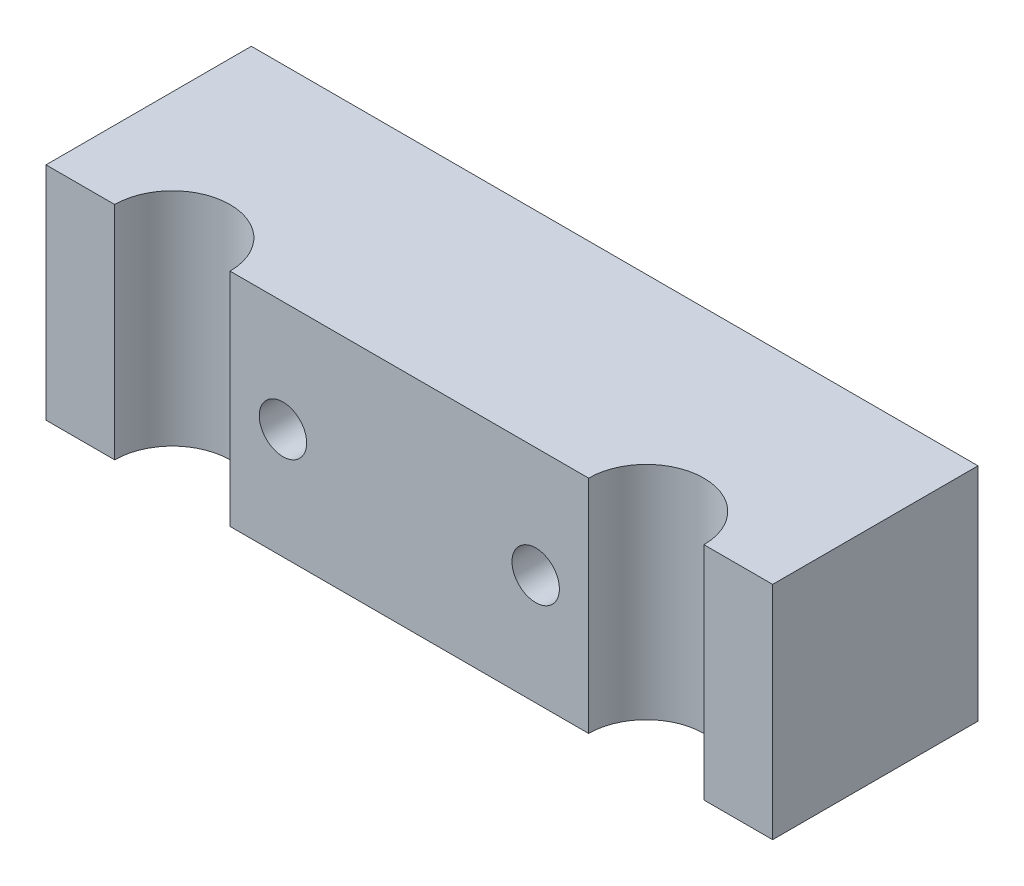
ISO-10303-21;
HEADER;
FILE_DESCRIPTION(('STEP AP214'),'2;1');
FILE_NAME('part.step','',(''),(''),'','','');
FILE_SCHEMA(('AUTOMOTIVE_DESIGN { 1 0 10303 214 1 1 1 1 }'));
ENDSEC;
DATA;
#1=APPLICATION_CONTEXT('core data for automotive mechanical design processes');
#2=APPLICATION_PROTOCOL_DEFINITION('international standard','automotive_design',2000,#1);
#3=PRODUCT_CONTEXT('',#1,'mechanical');
#4=PRODUCT('Part','Part','',(#3));
#5=PRODUCT_RELATED_PRODUCT_CATEGORY('part','',(#4));
#6=PRODUCT_DEFINITION_FORMATION('','',#4);
#7=PRODUCT_DEFINITION_CONTEXT('part definition',#1,'design');
#8=PRODUCT_DEFINITION('design','',#6,#7);
#9=PRODUCT_DEFINITION_SHAPE('','',#8);
#10=(LENGTH_UNIT() NAMED_UNIT(*) SI_UNIT(.MILLI.,.METRE.));
#11=(NAMED_UNIT(*) PLANE_ANGLE_UNIT() SI_UNIT($,.RADIAN.));
#12=(NAMED_UNIT(*) SI_UNIT($,.STERADIAN.) SOLID_ANGLE_UNIT());
#13=UNCERTAINTY_MEASURE_WITH_UNIT(LENGTH_MEASURE(1.E-05),#10,'distance_accuracy_value','');
#14=(GEOMETRIC_REPRESENTATION_CONTEXT(3) GLOBAL_UNCERTAINTY_ASSIGNED_CONTEXT((#13)) GLOBAL_UNIT_ASSIGNED_CONTEXT((#10,
#11,#12)) REPRESENTATION_CONTEXT('',''));
#15=CARTESIAN_POINT('',(0.,0.,0.));
#16=DIRECTION('',(0.,0.,1.));
#17=DIRECTION('',(1.,0.,0.));
#18=AXIS2_PLACEMENT_3D('',#15,#16,#17);
#19=CARTESIAN_POINT('',(8.,0.,-0.000999999999999265));
#20=DIRECTION('',(0.,0.,1.));
#21=DIRECTION('',(1.,0.,0.));
#22=AXIS2_PLACEMENT_3D('',#19,#20,#21);
#23=CYLINDRICAL_SURFACE('',#22,1.5);
#24=CARTESIAN_POINT('',(8.,0.,13.));
#25=DIRECTION('',(0.,0.,1.));
#26=DIRECTION('',(-1.,0.,0.));
#27=AXIS2_PLACEMENT_3D('',#24,#25,#26);
#28=CIRCLE('',#27,1.5);
#29=CARTESIAN_POINT('',(6.5,0.,13.));
#30=VERTEX_POINT('',#29);
#31=EDGE_CURVE('E173',#30,#30,#28,.T.);
#32=ORIENTED_EDGE('',*,*,#31,.T.);
#33=EDGE_LOOP('',(#32));
#34=FACE_BOUND('',#33,.T.);
#35=CARTESIAN_POINT('',(8.,0.,3.8));
#36=DIRECTION('',(0.,0.,-1.));
#37=DIRECTION('',(-1.,0.,0.));
#38=AXIS2_PLACEMENT_3D('',#35,#36,#37);
#39=CIRCLE('',#38,1.5);
#40=CARTESIAN_POINT('',(6.5,0.,3.8));
#41=VERTEX_POINT('',#40);
#42=EDGE_CURVE('E37',#41,#41,#39,.F.);
#43=ORIENTED_EDGE('',*,*,#42,.F.);
#44=EDGE_LOOP('',(#43));
#45=FACE_BOUND('',#44,.T.);
#46=ADVANCED_FACE('F33',(#34,#45),#23,.F.);
#47=CARTESIAN_POINT('',(-8.,0.,-0.000999999999999265));
#48=DIRECTION('',(0.,0.,1.));
#49=DIRECTION('',(1.,0.,0.));
#50=AXIS2_PLACEMENT_3D('',#47,#48,#49);
#51=CYLINDRICAL_SURFACE('',#50,1.5);
#52=CARTESIAN_POINT('',(-8.,0.,13.));
#53=DIRECTION('',(0.,0.,1.));
#54=DIRECTION('',(1.,0.,0.));
#55=AXIS2_PLACEMENT_3D('',#52,#53,#54);
#56=CIRCLE('',#55,1.5);
#57=CARTESIAN_POINT('',(-6.5,0.,13.));
#58=VERTEX_POINT('',#57);
#59=EDGE_CURVE('E140',#58,#58,#56,.T.);
#60=ORIENTED_EDGE('',*,*,#59,.T.);
#61=EDGE_LOOP('',(#60));
#62=FACE_BOUND('',#61,.T.);
#63=CARTESIAN_POINT('',(-8.,0.,3.8));
#64=DIRECTION('',(0.,0.,-1.));
#65=DIRECTION('',(-1.,0.,0.));
#66=AXIS2_PLACEMENT_3D('',#63,#64,#65);
#67=CIRCLE('',#66,1.5);
#68=CARTESIAN_POINT('',(-9.5,0.,3.8));
#69=VERTEX_POINT('',#68);
#70=EDGE_CURVE('E150',#69,#69,#67,.F.);
#71=ORIENTED_EDGE('',*,*,#70,.F.);
#72=EDGE_LOOP('',(#71));
#73=FACE_BOUND('',#72,.T.);
#74=ADVANCED_FACE('F225',(#62,#73),#51,.F.);
#75=CARTESIAN_POINT('',(0.,0.,13.));
#76=DIRECTION('',(0.,0.,-1.));
#77=DIRECTION('',(-1.,0.,0.));
#78=AXIS2_PLACEMENT_3D('',#75,#76,#77);
#79=PLANE('',#78);
#80=DIRECTION('',(1.,0.,0.));
#81=VECTOR('',#80,1.);
#82=CARTESIAN_POINT('',(-23.,-7.,13.));
#83=LINE('',#82,#81);
#84=CARTESIAN_POINT('',(-23.,-7.,13.));
#85=VERTEX_POINT('',#84);
#86=CARTESIAN_POINT('',(-18.65,-7.,13.));
#87=VERTEX_POINT('',#86);
#88=EDGE_CURVE('E114',#85,#87,#83,.T.);
#89=ORIENTED_EDGE('',*,*,#88,.T.);
#90=DIRECTION('',(0.,1.,0.));
#91=VECTOR('',#90,1.);
#92=CARTESIAN_POINT('',(-18.65,-7.001,13.));
#93=LINE('',#92,#91);
#94=CARTESIAN_POINT('',(-18.65,7.,13.));
#95=VERTEX_POINT('',#94);
#96=EDGE_CURVE('E101',#95,#87,#93,.F.);
#97=ORIENTED_EDGE('',*,*,#96,.F.);
#98=DIRECTION('',(-1.,0.,0.));
#99=VECTOR('',#98,1.);
#100=CARTESIAN_POINT('',(-23.,7.,13.));
#101=LINE('',#100,#99);
#102=CARTESIAN_POINT('',(-23.,7.,13.));
#103=VERTEX_POINT('',#102);
#104=EDGE_CURVE('E111',#95,#103,#101,.T.);
#105=ORIENTED_EDGE('',*,*,#104,.T.);
#106=DIRECTION('',(0.,-1.,0.));
#107=VECTOR('',#106,1.);
#108=CARTESIAN_POINT('',(-23.,-7.,13.));
#109=LINE('',#108,#107);
#110=EDGE_CURVE('E128',#103,#85,#109,.T.);
#111=ORIENTED_EDGE('',*,*,#110,.T.);
#112=EDGE_LOOP('',(#89,#97,#105,#111));
#113=FACE_BOUND('',#112,.T.);
#114=ADVANCED_FACE('F110',(#113),#79,.F.);
#115=ORIENTED_EDGE('',*,*,#31,.F.);
#116=EDGE_LOOP('',(#115));
#117=FACE_BOUND('',#116,.T.);
#118=ORIENTED_EDGE('',*,*,#59,.F.);
#119=EDGE_LOOP('',(#118));
#120=FACE_BOUND('',#119,.T.);
#121=CARTESIAN_POINT('',(11.35,7.,13.));
#122=VERTEX_POINT('',#121);
#123=CARTESIAN_POINT('',(-11.35,7.,13.));
#124=VERTEX_POINT('',#123);
#125=EDGE_CURVE('E119',#122,#124,#101,.T.);
#126=ORIENTED_EDGE('',*,*,#125,.T.);
#127=DIRECTION('',(0.,1.,0.));
#128=VECTOR('',#127,1.);
#129=CARTESIAN_POINT('',(-11.35,-7.001,13.));
#130=LINE('',#129,#128);
#131=CARTESIAN_POINT('',(-11.35,-7.,13.));
#132=VERTEX_POINT('',#131);
#133=EDGE_CURVE('E102',#132,#124,#130,.T.);
#134=ORIENTED_EDGE('',*,*,#133,.F.);
#135=CARTESIAN_POINT('',(11.35,-7.,13.));
#136=VERTEX_POINT('',#135);
#137=EDGE_CURVE('E132',#132,#136,#83,.T.);
#138=ORIENTED_EDGE('',*,*,#137,.T.);
#139=DIRECTION('',(0.,1.,0.));
#140=VECTOR('',#139,1.);
#141=CARTESIAN_POINT('',(11.35,-7.001,13.));
#142=LINE('',#141,#140);
#143=EDGE_CURVE('E175',#122,#136,#142,.F.);
#144=ORIENTED_EDGE('',*,*,#143,.F.);
#145=EDGE_LOOP('',(#126,#134,#138,#144));
#146=FACE_BOUND('',#145,.T.);
#147=ADVANCED_FACE('F187',(#117,#120,#146),#79,.F.);
#148=CARTESIAN_POINT('',(23.,-7.,13.));
#149=DIRECTION('',(-1.,0.,0.));
#150=DIRECTION('',(0.,0.,1.));
#151=AXIS2_PLACEMENT_3D('',#148,#149,#150);
#152=PLANE('',#151);
#153=DIRECTION('',(0.,1.,0.));
#154=VECTOR('',#153,1.);
#155=CARTESIAN_POINT('',(23.,-7.,0.));
#156=LINE('',#155,#154);
#157=CARTESIAN_POINT('',(23.,-7.,0.));
#158=VERTEX_POINT('',#157);
#159=CARTESIAN_POINT('',(23.,7.,0.));
#160=VERTEX_POINT('',#159);
#161=EDGE_CURVE('E136',#158,#160,#156,.T.);
#162=ORIENTED_EDGE('',*,*,#161,.T.);
#163=DIRECTION('',(0.,0.,-1.));
#164=VECTOR('',#163,1.);
#165=CARTESIAN_POINT('',(23.,7.,13.));
#166=LINE('',#165,#164);
#167=CARTESIAN_POINT('',(23.,7.,13.));
#168=VERTEX_POINT('',#167);
#169=EDGE_CURVE('E11',#168,#160,#166,.T.);
#170=ORIENTED_EDGE('',*,*,#169,.F.);
#171=DIRECTION('',(0.,1.,0.));
#172=VECTOR('',#171,1.);
#173=CARTESIAN_POINT('',(23.,-7.,13.));
#174=LINE('',#173,#172);
#175=CARTESIAN_POINT('',(23.,-7.,13.));
#176=VERTEX_POINT('',#175);
#177=EDGE_CURVE('E120',#176,#168,#174,.T.);
#178=ORIENTED_EDGE('',*,*,#177,.F.);
#179=DIRECTION('',(0.,0.,-1.));
#180=VECTOR('',#179,1.);
#181=CARTESIAN_POINT('',(23.,-7.,13.));
#182=LINE('',#181,#180);
#183=EDGE_CURVE('E135',#176,#158,#182,.T.);
#184=ORIENTED_EDGE('',*,*,#183,.T.);
#185=EDGE_LOOP('',(#162,#170,#178,#184));
#186=FACE_BOUND('',#185,.T.);
#187=ADVANCED_FACE('F35',(#186),#152,.F.);
#188=CARTESIAN_POINT('',(-23.,7.,13.));
#189=DIRECTION('',(0.,-1.,0.));
#190=DIRECTION('',(0.,0.,-1.));
#191=AXIS2_PLACEMENT_3D('',#188,#189,#190);
#192=PLANE('',#191);
#193=ORIENTED_EDGE('',*,*,#104,.F.);
#194=CARTESIAN_POINT('',(-15.,7.,13.));
#195=DIRECTION('',(0.,1.,0.));
#196=DIRECTION('',(0.,0.,1.));
#197=AXIS2_PLACEMENT_3D('',#194,#195,#196);
#198=CIRCLE('',#197,3.65);
#199=EDGE_CURVE('E98',#124,#95,#198,.T.);
#200=ORIENTED_EDGE('',*,*,#199,.F.);
#201=ORIENTED_EDGE('',*,*,#125,.F.);
#202=CARTESIAN_POINT('',(15.,7.,13.));
#203=DIRECTION('',(0.,1.,0.));
#204=DIRECTION('',(0.,0.,-1.));
#205=AXIS2_PLACEMENT_3D('',#202,#203,#204);
#206=CIRCLE('',#205,3.65);
#207=CARTESIAN_POINT('',(18.65,7.,13.));
#208=VERTEX_POINT('',#207);
#209=EDGE_CURVE('E177',#208,#122,#206,.T.);
#210=ORIENTED_EDGE('',*,*,#209,.F.);
#211=EDGE_CURVE('E122',#168,#208,#101,.T.);
#212=ORIENTED_EDGE('',*,*,#211,.F.);
#213=ORIENTED_EDGE('',*,*,#169,.T.);
#214=DIRECTION('',(-1.,0.,0.));
#215=VECTOR('',#214,1.);
#216=CARTESIAN_POINT('',(-23.,7.,0.));
#217=LINE('',#216,#215);
#218=CARTESIAN_POINT('',(-23.,7.,0.));
#219=VERTEX_POINT('',#218);
#220=EDGE_CURVE('E139',#160,#219,#217,.T.);
#221=ORIENTED_EDGE('',*,*,#220,.T.);
#222=DIRECTION('',(0.,0.,-1.));
#223=VECTOR('',#222,1.);
#224=CARTESIAN_POINT('',(-23.,7.,13.));
#225=LINE('',#224,#223);
#226=EDGE_CURVE('E42',#103,#219,#225,.T.);
#227=ORIENTED_EDGE('',*,*,#226,.F.);
#228=EDGE_LOOP('',(#193,#200,#201,#210,#212,#213,#221,#227));
#229=FACE_BOUND('',#228,.T.);
#230=ADVANCED_FACE('F116',(#229),#192,.F.);
#231=CARTESIAN_POINT('',(-23.,-7.,13.));
#232=DIRECTION('',(1.,0.,0.));
#233=DIRECTION('',(0.,0.,-1.));
#234=AXIS2_PLACEMENT_3D('',#231,#232,#233);
#235=PLANE('',#234);
#236=DIRECTION('',(0.,-1.,0.));
#237=VECTOR('',#236,1.);
#238=CARTESIAN_POINT('',(-23.,-7.,0.));
#239=LINE('',#238,#237);
#240=CARTESIAN_POINT('',(-23.,-7.,0.));
#241=VERTEX_POINT('',#240);
#242=EDGE_CURVE('E142',#219,#241,#239,.T.);
#243=ORIENTED_EDGE('',*,*,#242,.T.);
#244=DIRECTION('',(0.,0.,-1.));
#245=VECTOR('',#244,1.);
#246=CARTESIAN_POINT('',(-23.,-7.,13.));
#247=LINE('',#246,#245);
#248=EDGE_CURVE('E147',#85,#241,#247,.T.);
#249=ORIENTED_EDGE('',*,*,#248,.F.);
#250=ORIENTED_EDGE('',*,*,#110,.F.);
#251=ORIENTED_EDGE('',*,*,#226,.T.);
#252=EDGE_LOOP('',(#243,#249,#250,#251));
#253=FACE_BOUND('',#252,.T.);
#254=ADVANCED_FACE('F211',(#253),#235,.F.);
#255=CARTESIAN_POINT('',(-23.,-7.,13.));
#256=DIRECTION('',(0.,1.,0.));
#257=DIRECTION('',(0.,0.,1.));
#258=AXIS2_PLACEMENT_3D('',#255,#256,#257);
#259=PLANE('',#258);
#260=ORIENTED_EDGE('',*,*,#137,.F.);
#261=CARTESIAN_POINT('',(-15.,-7.,13.));
#262=DIRECTION('',(0.,1.,0.));
#263=DIRECTION('',(0.,0.,1.));
#264=AXIS2_PLACEMENT_3D('',#261,#262,#263);
#265=CIRCLE('',#264,3.65);
#266=EDGE_CURVE('E58',#87,#132,#265,.F.);
#267=ORIENTED_EDGE('',*,*,#266,.F.);
#268=ORIENTED_EDGE('',*,*,#88,.F.);
#269=ORIENTED_EDGE('',*,*,#248,.T.);
#270=DIRECTION('',(1.,0.,0.));
#271=VECTOR('',#270,1.);
#272=CARTESIAN_POINT('',(-23.,-7.,0.));
#273=LINE('',#272,#271);
#274=EDGE_CURVE('E124',#241,#158,#273,.T.);
#275=ORIENTED_EDGE('',*,*,#274,.T.);
#276=ORIENTED_EDGE('',*,*,#183,.F.);
#277=CARTESIAN_POINT('',(18.65,-7.,13.));
#278=VERTEX_POINT('',#277);
#279=EDGE_CURVE('E130',#278,#176,#83,.T.);
#280=ORIENTED_EDGE('',*,*,#279,.F.);
#281=CARTESIAN_POINT('',(15.,-7.,13.));
#282=DIRECTION('',(0.,1.,0.));
#283=DIRECTION('',(0.,0.,1.));
#284=AXIS2_PLACEMENT_3D('',#281,#282,#283);
#285=CIRCLE('',#284,3.65);
#286=EDGE_CURVE('E50',#136,#278,#285,.F.);
#287=ORIENTED_EDGE('',*,*,#286,.F.);
#288=EDGE_LOOP('',(#260,#267,#268,#269,#275,#276,#280,#287));
#289=FACE_BOUND('',#288,.T.);
#290=ADVANCED_FACE('F202',(#289),#259,.F.);
#291=ORIENTED_EDGE('',*,*,#211,.T.);
#292=DIRECTION('',(0.,1.,0.));
#293=VECTOR('',#292,1.);
#294=CARTESIAN_POINT('',(18.65,-7.001,13.));
#295=LINE('',#294,#293);
#296=EDGE_CURVE('E156',#278,#208,#295,.T.);
#297=ORIENTED_EDGE('',*,*,#296,.F.);
#298=ORIENTED_EDGE('',*,*,#279,.T.);
#299=ORIENTED_EDGE('',*,*,#177,.T.);
#300=EDGE_LOOP('',(#291,#297,#298,#299));
#301=FACE_BOUND('',#300,.T.);
#302=ADVANCED_FACE('F191',(#301),#79,.F.);
#303=CARTESIAN_POINT('',(0.,0.,0.));
#304=DIRECTION('',(0.,0.,-1.));
#305=DIRECTION('',(-1.,0.,0.));
#306=AXIS2_PLACEMENT_3D('',#303,#304,#305);
#307=PLANE('',#306);
#308=CARTESIAN_POINT('',(8.,0.,0.));
#309=DIRECTION('',(0.,0.,-1.));
#310=DIRECTION('',(-1.,0.,0.));
#311=AXIS2_PLACEMENT_3D('',#308,#309,#310);
#312=CIRCLE('',#311,3.);
#313=CARTESIAN_POINT('',(5.,0.,0.));
#314=VERTEX_POINT('',#313);
#315=EDGE_CURVE('E158',#314,#314,#312,.T.);
#316=ORIENTED_EDGE('',*,*,#315,.F.);
#317=EDGE_LOOP('',(#316));
#318=FACE_BOUND('',#317,.T.);
#319=CARTESIAN_POINT('',(-8.,0.,0.));
#320=DIRECTION('',(0.,0.,-1.));
#321=DIRECTION('',(-1.,0.,0.));
#322=AXIS2_PLACEMENT_3D('',#319,#320,#321);
#323=CIRCLE('',#322,3.);
#324=CARTESIAN_POINT('',(-11.,0.,0.));
#325=VERTEX_POINT('',#324);
#326=EDGE_CURVE('E168',#325,#325,#323,.T.);
#327=ORIENTED_EDGE('',*,*,#326,.F.);
#328=EDGE_LOOP('',(#327));
#329=FACE_BOUND('',#328,.T.);
#330=ORIENTED_EDGE('',*,*,#161,.F.);
#331=ORIENTED_EDGE('',*,*,#274,.F.);
#332=ORIENTED_EDGE('',*,*,#242,.F.);
#333=ORIENTED_EDGE('',*,*,#220,.F.);
#334=EDGE_LOOP('',(#330,#331,#332,#333));
#335=FACE_BOUND('',#334,.T.);
#336=ADVANCED_FACE('F212',(#318,#329,#335),#307,.T.);
#337=CARTESIAN_POINT('',(15.,-7.001,13.));
#338=DIRECTION('',(0.,1.,0.));
#339=DIRECTION('',(0.,0.,1.));
#340=AXIS2_PLACEMENT_3D('',#337,#338,#339);
#341=CYLINDRICAL_SURFACE('',#340,3.65);
#342=ORIENTED_EDGE('',*,*,#143,.T.);
#343=ORIENTED_EDGE('',*,*,#286,.T.);
#344=ORIENTED_EDGE('',*,*,#296,.T.);
#345=ORIENTED_EDGE('',*,*,#209,.T.);
#346=EDGE_LOOP('',(#342,#343,#344,#345));
#347=FACE_BOUND('',#346,.T.);
#348=ADVANCED_FACE('F198',(#347),#341,.F.);
#349=CARTESIAN_POINT('',(-15.,-7.001,13.));
#350=DIRECTION('',(0.,1.,0.));
#351=DIRECTION('',(0.,0.,1.));
#352=AXIS2_PLACEMENT_3D('',#349,#350,#351);
#353=CYLINDRICAL_SURFACE('',#352,3.65);
#354=ORIENTED_EDGE('',*,*,#96,.T.);
#355=ORIENTED_EDGE('',*,*,#266,.T.);
#356=ORIENTED_EDGE('',*,*,#133,.T.);
#357=ORIENTED_EDGE('',*,*,#199,.T.);
#358=EDGE_LOOP('',(#354,#355,#356,#357));
#359=FACE_BOUND('',#358,.T.);
#360=ADVANCED_FACE('F100',(#359),#353,.F.);
#361=CARTESIAN_POINT('',(-8.,0.,3.8));
#362=DIRECTION('',(0.,0.,-1.));
#363=DIRECTION('',(-1.,0.,0.));
#364=AXIS2_PLACEMENT_3D('',#361,#362,#363);
#365=PLANE('',#364);
#366=CARTESIAN_POINT('',(-8.,0.,3.8));
#367=DIRECTION('',(0.,0.,-1.));
#368=DIRECTION('',(-1.,0.,0.));
#369=AXIS2_PLACEMENT_3D('',#366,#367,#368);
#370=CIRCLE('',#369,3.);
#371=CARTESIAN_POINT('',(-11.,0.,3.8));
#372=VERTEX_POINT('',#371);
#373=EDGE_CURVE('E163',#372,#372,#370,.T.);
#374=ORIENTED_EDGE('',*,*,#373,.T.);
#375=EDGE_LOOP('',(#374));
#376=FACE_BOUND('',#375,.T.);
#377=ORIENTED_EDGE('',*,*,#70,.T.);
#378=EDGE_LOOP('',(#377));
#379=FACE_BOUND('',#378,.T.);
#380=ADVANCED_FACE('F235',(#376,#379),#365,.T.);
#381=CARTESIAN_POINT('',(-8.,0.,3.8));
#382=DIRECTION('',(0.,0.,-1.));
#383=DIRECTION('',(-1.,0.,0.));
#384=AXIS2_PLACEMENT_3D('',#381,#382,#383);
#385=CYLINDRICAL_SURFACE('',#384,3.);
#386=CARTESIAN_POINT('',(-11.,0.,3.8));
#387=CARTESIAN_POINT('',(-11.,0.,3.76041666666667));
#388=CARTESIAN_POINT('',(-11.,0.,3.72083333333333));
#389=CARTESIAN_POINT('',(-11.,0.,3.64166666666667));
#390=CARTESIAN_POINT('',(-11.,0.,3.60208333333333));
#391=CARTESIAN_POINT('',(-11.,0.,3.52291666666667));
#392=CARTESIAN_POINT('',(-11.,0.,3.48333333333333));
#393=CARTESIAN_POINT('',(-11.,0.,3.40416666666667));
#394=CARTESIAN_POINT('',(-11.,0.,3.36458333333333));
#395=CARTESIAN_POINT('',(-11.,0.,3.28541666666667));
#396=CARTESIAN_POINT('',(-11.,0.,3.24583333333333));
#397=CARTESIAN_POINT('',(-11.,0.,3.16666666666667));
#398=CARTESIAN_POINT('',(-11.,0.,3.12708333333333));
#399=CARTESIAN_POINT('',(-11.,0.,3.04791666666667));
#400=CARTESIAN_POINT('',(-11.,0.,3.00833333333333));
#401=CARTESIAN_POINT('',(-11.,0.,2.92916666666667));
#402=CARTESIAN_POINT('',(-11.,0.,2.88958333333333));
#403=CARTESIAN_POINT('',(-11.,0.,2.81041666666667));
#404=CARTESIAN_POINT('',(-11.,0.,2.77083333333333));
#405=CARTESIAN_POINT('',(-11.,0.,2.69166666666667));
#406=CARTESIAN_POINT('',(-11.,0.,2.65208333333333));
#407=CARTESIAN_POINT('',(-11.,0.,2.57291666666667));
#408=CARTESIAN_POINT('',(-11.,0.,2.53333333333333));
#409=CARTESIAN_POINT('',(-11.,0.,2.45416666666667));
#410=CARTESIAN_POINT('',(-11.,0.,2.41458333333333));
#411=CARTESIAN_POINT('',(-11.,0.,2.33541666666667));
#412=CARTESIAN_POINT('',(-11.,0.,2.29583333333333));
#413=CARTESIAN_POINT('',(-11.,0.,2.21666666666667));
#414=CARTESIAN_POINT('',(-11.,0.,2.17708333333333));
#415=CARTESIAN_POINT('',(-11.,0.,2.09791666666667));
#416=CARTESIAN_POINT('',(-11.,0.,2.05833333333333));
#417=CARTESIAN_POINT('',(-11.,0.,1.97916666666667));
#418=CARTESIAN_POINT('',(-11.,0.,1.93958333333333));
#419=CARTESIAN_POINT('',(-11.,0.,1.86041666666667));
#420=CARTESIAN_POINT('',(-11.,0.,1.82083333333333));
#421=CARTESIAN_POINT('',(-11.,0.,1.74166666666667));
#422=CARTESIAN_POINT('',(-11.,0.,1.70208333333333));
#423=CARTESIAN_POINT('',(-11.,0.,1.62291666666667));
#424=CARTESIAN_POINT('',(-11.,0.,1.58333333333333));
#425=CARTESIAN_POINT('',(-11.,0.,1.50416666666667));
#426=CARTESIAN_POINT('',(-11.,0.,1.46458333333333));
#427=CARTESIAN_POINT('',(-11.,0.,1.38541666666667));
#428=CARTESIAN_POINT('',(-11.,0.,1.34583333333333));
#429=CARTESIAN_POINT('',(-11.,0.,1.26666666666667));
#430=CARTESIAN_POINT('',(-11.,0.,1.22708333333333));
#431=CARTESIAN_POINT('',(-11.,0.,1.14791666666667));
#432=CARTESIAN_POINT('',(-11.,0.,1.10833333333333));
#433=CARTESIAN_POINT('',(-11.,0.,1.02916666666667));
#434=CARTESIAN_POINT('',(-11.,0.,0.989583333333334));
#435=CARTESIAN_POINT('',(-11.,0.,0.910416666666667));
#436=CARTESIAN_POINT('',(-11.,0.,0.870833333333334));
#437=CARTESIAN_POINT('',(-11.,0.,0.791666666666667));
#438=CARTESIAN_POINT('',(-11.,0.,0.752083333333333));
#439=CARTESIAN_POINT('',(-11.,0.,0.672916666666667));
#440=CARTESIAN_POINT('',(-11.,0.,0.633333333333333));
#441=CARTESIAN_POINT('',(-11.,0.,0.554166666666667));
#442=CARTESIAN_POINT('',(-11.,0.,0.514583333333334));
#443=CARTESIAN_POINT('',(-11.,0.,0.435416666666667));
#444=CARTESIAN_POINT('',(-11.,0.,0.395833333333334));
#445=CARTESIAN_POINT('',(-11.,0.,0.316666666666667));
#446=CARTESIAN_POINT('',(-11.,0.,0.277083333333333));
#447=CARTESIAN_POINT('',(-11.,0.,0.197916666666667));
#448=CARTESIAN_POINT('',(-11.,0.,0.158333333333333));
#449=CARTESIAN_POINT('',(-11.,0.,0.0791666666666666));
#450=CARTESIAN_POINT('',(-11.,0.,0.0395833333333333));
#451=CARTESIAN_POINT('',(-11.,0.,0.));
#452=B_SPLINE_CURVE_WITH_KNOTS('',3,(#386,#387,#388,#389,#390,#391,#392,#393,#394,#395,#396,
#397,#398,#399,#400,#401,#402,#403,#404,#405,#406,#407,#408,#409,#410,#411,#412,#413,#414,#415,
#416,#417,#418,#419,#420,#421,#422,#423,#424,#425,#426,#427,#428,#429,#430,#431,#432,#433,#434,
#435,#436,#437,#438,#439,#440,#441,#442,#443,#444,#445,#446,#447,#448,#449,#450,#451),
.UNSPECIFIED.,.F.,.F.,(4,2,2,2,2,2,2,2,2,2,2,2,2,2,2,2,2,2,2,2,2,2,2,2,2,2,2,2,2,2,2,2,4),(0.,
0.11875,0.2375,0.35625,0.475,0.59375,0.7125,0.83125,0.95,1.06875,1.1875,1.30625,1.425,1.54375,
1.6625,1.78125,1.9,2.01875,2.1375,2.25625,2.375,2.49375,2.6125,2.73125,2.85,2.96875,3.0875,
3.20625,3.325,3.44375,3.5625,3.68125,3.8),.UNSPECIFIED.);
#453=EDGE_CURVE('BSEAM236',#372,#325,#452,.T.);
#454=ORIENTED_EDGE('',*,*,#373,.F.);
#455=ORIENTED_EDGE('',*,*,#326,.T.);
#456=ORIENTED_EDGE('',*,*,#453,.T.);
#457=ORIENTED_EDGE('',*,*,#453,.F.);
#458=EDGE_LOOP('',(#454,#456,#455,#457));
#459=FACE_BOUND('',#458,.T.);
#460=ADVANCED_FACE('F236',(#459),#385,.F.);
#461=CARTESIAN_POINT('',(8.,0.,3.8));
#462=DIRECTION('',(0.,0.,-1.));
#463=DIRECTION('',(-1.,0.,0.));
#464=AXIS2_PLACEMENT_3D('',#461,#462,#463);
#465=PLANE('',#464);
#466=CARTESIAN_POINT('',(8.,0.,3.8));
#467=DIRECTION('',(0.,0.,-1.));
#468=DIRECTION('',(-1.,0.,0.));
#469=AXIS2_PLACEMENT_3D('',#466,#467,#468);
#470=CIRCLE('',#469,3.);
#471=CARTESIAN_POINT('',(5.,0.,3.8));
#472=VERTEX_POINT('',#471);
#473=EDGE_CURVE('E152',#472,#472,#470,.T.);
#474=ORIENTED_EDGE('',*,*,#473,.T.);
#475=EDGE_LOOP('',(#474));
#476=FACE_BOUND('',#475,.T.);
#477=ORIENTED_EDGE('',*,*,#42,.T.);
#478=EDGE_LOOP('',(#477));
#479=FACE_BOUND('',#478,.T.);
#480=ADVANCED_FACE('F239',(#476,#479),#465,.T.);
#481=CARTESIAN_POINT('',(8.,0.,3.8));
#482=DIRECTION('',(0.,0.,-1.));
#483=DIRECTION('',(-1.,0.,0.));
#484=AXIS2_PLACEMENT_3D('',#481,#482,#483);
#485=CYLINDRICAL_SURFACE('',#484,3.);
#486=CARTESIAN_POINT('',(5.,0.,3.8));
#487=CARTESIAN_POINT('',(5.,0.,3.76041666666667));
#488=CARTESIAN_POINT('',(5.,0.,3.72083333333333));
#489=CARTESIAN_POINT('',(5.,0.,3.64166666666667));
#490=CARTESIAN_POINT('',(5.,0.,3.60208333333333));
#491=CARTESIAN_POINT('',(5.,0.,3.52291666666667));
#492=CARTESIAN_POINT('',(5.,0.,3.48333333333333));
#493=CARTESIAN_POINT('',(5.,0.,3.40416666666667));
#494=CARTESIAN_POINT('',(5.,0.,3.36458333333333));
#495=CARTESIAN_POINT('',(5.,0.,3.28541666666667));
#496=CARTESIAN_POINT('',(5.,0.,3.24583333333333));
#497=CARTESIAN_POINT('',(5.,0.,3.16666666666667));
#498=CARTESIAN_POINT('',(5.,0.,3.12708333333333));
#499=CARTESIAN_POINT('',(5.,0.,3.04791666666667));
#500=CARTESIAN_POINT('',(5.,0.,3.00833333333333));
#501=CARTESIAN_POINT('',(5.,0.,2.92916666666667));
#502=CARTESIAN_POINT('',(5.,0.,2.88958333333333));
#503=CARTESIAN_POINT('',(5.,0.,2.81041666666667));
#504=CARTESIAN_POINT('',(5.,0.,2.77083333333333));
#505=CARTESIAN_POINT('',(5.,0.,2.69166666666667));
#506=CARTESIAN_POINT('',(5.,0.,2.65208333333333));
#507=CARTESIAN_POINT('',(5.,0.,2.57291666666667));
#508=CARTESIAN_POINT('',(5.,0.,2.53333333333333));
#509=CARTESIAN_POINT('',(5.,0.,2.45416666666667));
#510=CARTESIAN_POINT('',(5.,0.,2.41458333333333));
#511=CARTESIAN_POINT('',(5.,0.,2.33541666666667));
#512=CARTESIAN_POINT('',(5.,0.,2.29583333333333));
#513=CARTESIAN_POINT('',(5.,0.,2.21666666666667));
#514=CARTESIAN_POINT('',(5.,0.,2.17708333333333));
#515=CARTESIAN_POINT('',(5.,0.,2.09791666666667));
#516=CARTESIAN_POINT('',(5.,0.,2.05833333333333));
#517=CARTESIAN_POINT('',(5.,0.,1.97916666666667));
#518=CARTESIAN_POINT('',(5.,0.,1.93958333333333));
#519=CARTESIAN_POINT('',(5.,0.,1.86041666666667));
#520=CARTESIAN_POINT('',(5.,0.,1.82083333333333));
#521=CARTESIAN_POINT('',(5.,0.,1.74166666666667));
#522=CARTESIAN_POINT('',(5.,0.,1.70208333333333));
#523=CARTESIAN_POINT('',(5.,0.,1.62291666666667));
#524=CARTESIAN_POINT('',(5.,0.,1.58333333333333));
#525=CARTESIAN_POINT('',(5.,0.,1.50416666666667));
#526=CARTESIAN_POINT('',(5.,0.,1.46458333333333));
#527=CARTESIAN_POINT('',(5.,0.,1.38541666666667));
#528=CARTESIAN_POINT('',(5.,0.,1.34583333333333));
#529=CARTESIAN_POINT('',(5.,0.,1.26666666666667));
#530=CARTESIAN_POINT('',(5.,0.,1.22708333333333));
#531=CARTESIAN_POINT('',(5.,0.,1.14791666666667));
#532=CARTESIAN_POINT('',(5.,0.,1.10833333333333));
#533=CARTESIAN_POINT('',(5.,0.,1.02916666666667));
#534=CARTESIAN_POINT('',(5.,0.,0.989583333333334));
#535=CARTESIAN_POINT('',(5.,0.,0.910416666666667));
#536=CARTESIAN_POINT('',(5.,0.,0.870833333333334));
#537=CARTESIAN_POINT('',(5.,0.,0.791666666666667));
#538=CARTESIAN_POINT('',(5.,0.,0.752083333333333));
#539=CARTESIAN_POINT('',(5.,0.,0.672916666666667));
#540=CARTESIAN_POINT('',(5.,0.,0.633333333333333));
#541=CARTESIAN_POINT('',(5.,0.,0.554166666666667));
#542=CARTESIAN_POINT('',(5.,0.,0.514583333333334));
#543=CARTESIAN_POINT('',(5.,0.,0.435416666666667));
#544=CARTESIAN_POINT('',(5.,0.,0.395833333333334));
#545=CARTESIAN_POINT('',(5.,0.,0.316666666666667));
#546=CARTESIAN_POINT('',(5.,0.,0.277083333333333));
#547=CARTESIAN_POINT('',(5.,0.,0.197916666666667));
#548=CARTESIAN_POINT('',(5.,0.,0.158333333333333));
#549=CARTESIAN_POINT('',(5.,0.,0.0791666666666666));
#550=CARTESIAN_POINT('',(5.,0.,0.0395833333333333));
#551=CARTESIAN_POINT('',(5.,0.,0.));
#552=B_SPLINE_CURVE_WITH_KNOTS('',3,(#486,#487,#488,#489,#490,#491,#492,#493,#494,#495,#496,
#497,#498,#499,#500,#501,#502,#503,#504,#505,#506,#507,#508,#509,#510,#511,#512,#513,#514,#515,
#516,#517,#518,#519,#520,#521,#522,#523,#524,#525,#526,#527,#528,#529,#530,#531,#532,#533,#534,
#535,#536,#537,#538,#539,#540,#541,#542,#543,#544,#545,#546,#547,#548,#549,#550,#551),
.UNSPECIFIED.,.F.,.F.,(4,2,2,2,2,2,2,2,2,2,2,2,2,2,2,2,2,2,2,2,2,2,2,2,2,2,2,2,2,2,2,2,4),(0.,
0.11875,0.2375,0.35625,0.475,0.59375,0.7125,0.83125,0.95,1.06875,1.1875,1.30625,1.425,1.54375,
1.6625,1.78125,1.9,2.01875,2.1375,2.25625,2.375,2.49375,2.6125,2.73125,2.85,2.96875,3.0875,
3.20625,3.325,3.44375,3.5625,3.68125,3.8),.UNSPECIFIED.);
#553=EDGE_CURVE('BSEAM244',#472,#314,#552,.T.);
#554=ORIENTED_EDGE('',*,*,#473,.F.);
#555=ORIENTED_EDGE('',*,*,#315,.T.);
#556=ORIENTED_EDGE('',*,*,#553,.T.);
#557=ORIENTED_EDGE('',*,*,#553,.F.);
#558=EDGE_LOOP('',(#554,#556,#555,#557));
#559=FACE_BOUND('',#558,.T.);
#560=ADVANCED_FACE('F244',(#559),#485,.F.);
#561=CLOSED_SHELL('',(#46,#74,#114,#147,#187,#230,#254,#290,#302,#336,#348,#360,#380,#460,#480,#560));
#562=MANIFOLD_SOLID_BREP('B2',#561);
#563=ADVANCED_BREP_SHAPE_REPRESENTATION('',(#18,#562),#14);
#564=SHAPE_DEFINITION_REPRESENTATION(#9,#563);
ENDSEC;
END-ISO-10303-21;
